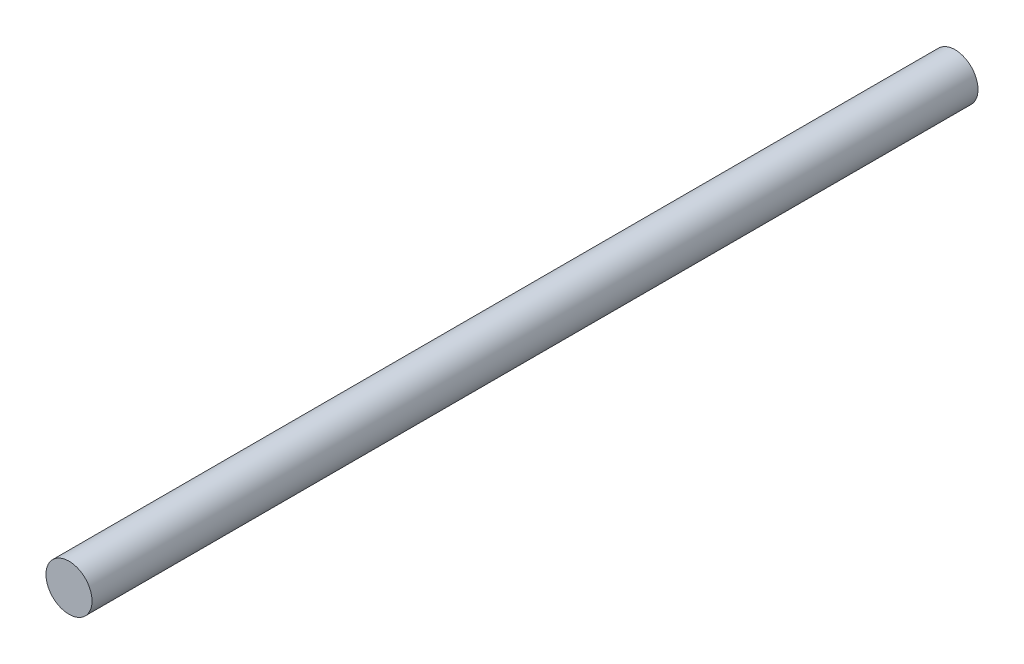
ISO-10303-21;
HEADER;
FILE_DESCRIPTION(('STEP AP214'),'2;1');
FILE_NAME('part.step','',(''),(''),'','','');
FILE_SCHEMA(('AUTOMOTIVE_DESIGN { 1 0 10303 214 1 1 1 1 }'));
ENDSEC;
DATA;
#1=APPLICATION_CONTEXT('core data for automotive mechanical design processes');
#2=APPLICATION_PROTOCOL_DEFINITION('international standard','automotive_design',2000,#1);
#3=PRODUCT_CONTEXT('',#1,'mechanical');
#4=PRODUCT('Part','Part','',(#3));
#5=PRODUCT_RELATED_PRODUCT_CATEGORY('part','',(#4));
#6=PRODUCT_DEFINITION_FORMATION('','',#4);
#7=PRODUCT_DEFINITION_CONTEXT('part definition',#1,'design');
#8=PRODUCT_DEFINITION('design','',#6,#7);
#9=PRODUCT_DEFINITION_SHAPE('','',#8);
#10=(LENGTH_UNIT() NAMED_UNIT(*) SI_UNIT(.MILLI.,.METRE.));
#11=(NAMED_UNIT(*) PLANE_ANGLE_UNIT() SI_UNIT($,.RADIAN.));
#12=(NAMED_UNIT(*) SI_UNIT($,.STERADIAN.) SOLID_ANGLE_UNIT());
#13=UNCERTAINTY_MEASURE_WITH_UNIT(LENGTH_MEASURE(1.E-05),#10,'distance_accuracy_value','');
#14=(GEOMETRIC_REPRESENTATION_CONTEXT(3) GLOBAL_UNCERTAINTY_ASSIGNED_CONTEXT((#13)) GLOBAL_UNIT_ASSIGNED_CONTEXT((#10,
#11,#12)) REPRESENTATION_CONTEXT('',''));
#15=CARTESIAN_POINT('',(0.,0.,0.));
#16=DIRECTION('',(0.,0.,1.));
#17=DIRECTION('',(1.,0.,0.));
#18=AXIS2_PLACEMENT_3D('',#15,#16,#17);
#19=CARTESIAN_POINT('',(-86.9967291869714,-495.578834458907,125.));
#20=DIRECTION('',(0.,0.,-1.));
#21=DIRECTION('',(-1.,0.,0.));
#22=AXIS2_PLACEMENT_3D('',#19,#20,#21);
#23=CYLINDRICAL_SURFACE('',#22,3.25000000000001);
#24=CARTESIAN_POINT('',(-86.9967291869714,-495.578834458907,125.));
#25=DIRECTION('',(0.,0.,1.));
#26=DIRECTION('',(1.,0.,0.));
#27=AXIS2_PLACEMENT_3D('',#24,#25,#26);
#28=CIRCLE('',#27,3.25000000000001);
#29=CARTESIAN_POINT('',(-83.7467291869714,-495.578834458907,125.));
#30=VERTEX_POINT('',#29);
#31=EDGE_CURVE('E10',#30,#30,#28,.T.);
#32=ORIENTED_EDGE('',*,*,#31,.F.);
#33=EDGE_LOOP('',(#32));
#34=FACE_BOUND('',#33,.T.);
#35=CARTESIAN_POINT('',(-86.9967291869714,-495.578834458907,0.));
#36=DIRECTION('',(0.,0.,1.));
#37=DIRECTION('',(1.,0.,0.));
#38=AXIS2_PLACEMENT_3D('',#35,#36,#37);
#39=CIRCLE('',#38,3.25000000000001);
#40=CARTESIAN_POINT('',(-83.7467291869714,-495.578834458907,0.));
#41=VERTEX_POINT('',#40);
#42=EDGE_CURVE('E45',#41,#41,#39,.T.);
#43=ORIENTED_EDGE('',*,*,#42,.T.);
#44=EDGE_LOOP('',(#43));
#45=FACE_BOUND('',#44,.T.);
#46=ADVANCED_FACE('F39',(#34,#45),#23,.T.);
#47=CARTESIAN_POINT('',(-86.9967291869714,-495.578834458907,125.));
#48=DIRECTION('',(0.,0.,1.));
#49=DIRECTION('',(1.,0.,0.));
#50=AXIS2_PLACEMENT_3D('',#47,#48,#49);
#51=PLANE('',#50);
#52=ORIENTED_EDGE('',*,*,#31,.T.);
#53=EDGE_LOOP('',(#52));
#54=FACE_BOUND('',#53,.T.);
#55=ADVANCED_FACE('F59',(#54),#51,.T.);
#56=CARTESIAN_POINT('',(-86.9967291869714,-495.578834458907,0.));
#57=DIRECTION('',(0.,0.,1.));
#58=DIRECTION('',(1.,0.,0.));
#59=AXIS2_PLACEMENT_3D('',#56,#57,#58);
#60=PLANE('',#59);
#61=ORIENTED_EDGE('',*,*,#42,.F.);
#62=EDGE_LOOP('',(#61));
#63=FACE_BOUND('',#62,.T.);
#64=ADVANCED_FACE('F57',(#63),#60,.F.);
#65=CLOSED_SHELL('',(#46,#55,#64));
#66=MANIFOLD_SOLID_BREP('B2',#65);
#67=ADVANCED_BREP_SHAPE_REPRESENTATION('',(#18,#66),#14);
#68=SHAPE_DEFINITION_REPRESENTATION(#9,#67);
ENDSEC;
END-ISO-10303-21;
